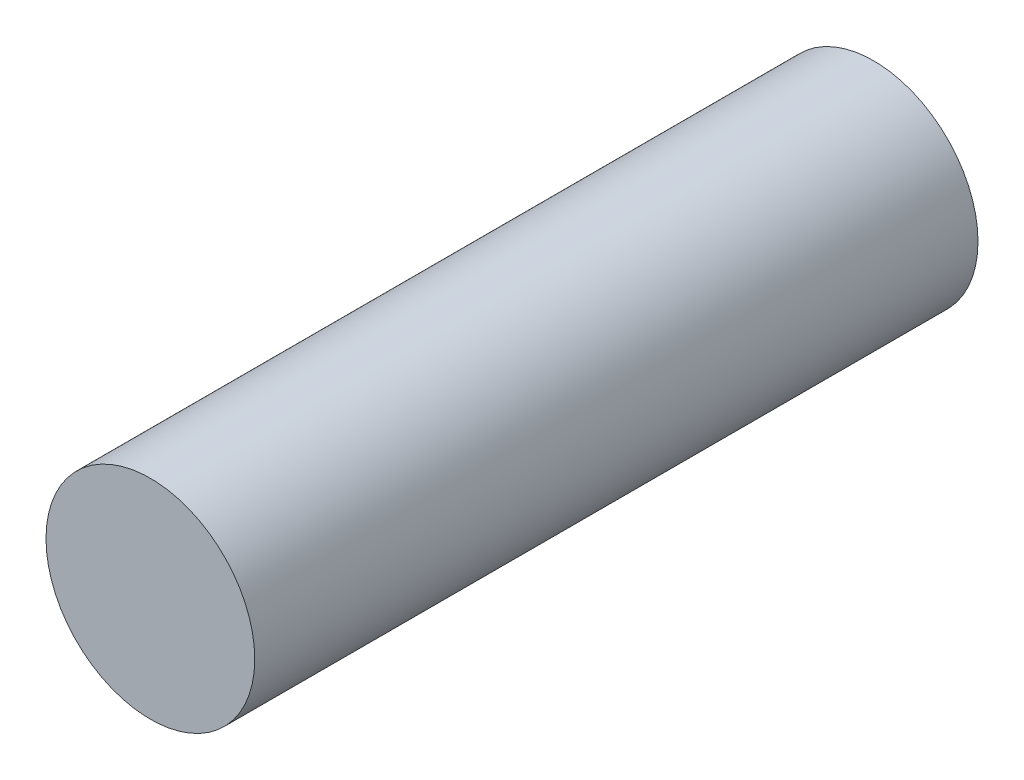
ISO-10303-21;
HEADER;
FILE_DESCRIPTION(('STEP AP214'),'2;1');
FILE_NAME('part.step','',(''),(''),'','','');
FILE_SCHEMA(('AUTOMOTIVE_DESIGN { 1 0 10303 214 1 1 1 1 }'));
ENDSEC;
DATA;
#1=APPLICATION_CONTEXT('core data for automotive mechanical design processes');
#2=APPLICATION_PROTOCOL_DEFINITION('international standard','automotive_design',2000,#1);
#3=PRODUCT_CONTEXT('',#1,'mechanical');
#4=PRODUCT('Part','Part','',(#3));
#5=PRODUCT_RELATED_PRODUCT_CATEGORY('part','',(#4));
#6=PRODUCT_DEFINITION_FORMATION('','',#4);
#7=PRODUCT_DEFINITION_CONTEXT('part definition',#1,'design');
#8=PRODUCT_DEFINITION('design','',#6,#7);
#9=PRODUCT_DEFINITION_SHAPE('','',#8);
#10=(LENGTH_UNIT() NAMED_UNIT(*) SI_UNIT(.MILLI.,.METRE.));
#11=(NAMED_UNIT(*) PLANE_ANGLE_UNIT() SI_UNIT($,.RADIAN.));
#12=(NAMED_UNIT(*) SI_UNIT($,.STERADIAN.) SOLID_ANGLE_UNIT());
#13=UNCERTAINTY_MEASURE_WITH_UNIT(LENGTH_MEASURE(1.E-05),#10,'distance_accuracy_value','');
#14=(GEOMETRIC_REPRESENTATION_CONTEXT(3) GLOBAL_UNCERTAINTY_ASSIGNED_CONTEXT((#13)) GLOBAL_UNIT_ASSIGNED_CONTEXT((#10,
#11,#12)) REPRESENTATION_CONTEXT('',''));
#15=CARTESIAN_POINT('',(0.,0.,0.));
#16=DIRECTION('',(0.,0.,1.));
#17=DIRECTION('',(1.,0.,0.));
#18=AXIS2_PLACEMENT_3D('',#15,#16,#17);
#19=CARTESIAN_POINT('',(0.,0.,22.));
#20=DIRECTION('',(0.,0.,-1.));
#21=DIRECTION('',(-1.,0.,0.));
#22=AXIS2_PLACEMENT_3D('',#19,#20,#21);
#23=CYLINDRICAL_SURFACE('',#22,3.175);
#24=CARTESIAN_POINT('',(0.,0.,22.));
#25=DIRECTION('',(0.,0.,1.));
#26=DIRECTION('',(1.,0.,0.));
#27=AXIS2_PLACEMENT_3D('',#24,#25,#26);
#28=CIRCLE('',#27,3.175);
#29=CARTESIAN_POINT('',(3.175,0.,22.));
#30=VERTEX_POINT('',#29);
#31=EDGE_CURVE('E10',#30,#30,#28,.T.);
#32=ORIENTED_EDGE('',*,*,#31,.F.);
#33=EDGE_LOOP('',(#32));
#34=FACE_BOUND('',#33,.T.);
#35=CARTESIAN_POINT('',(0.,0.,0.));
#36=DIRECTION('',(0.,0.,1.));
#37=DIRECTION('',(1.,0.,0.));
#38=AXIS2_PLACEMENT_3D('',#35,#36,#37);
#39=CIRCLE('',#38,3.175);
#40=CARTESIAN_POINT('',(3.175,0.,0.));
#41=VERTEX_POINT('',#40);
#42=EDGE_CURVE('E46',#41,#41,#39,.T.);
#43=ORIENTED_EDGE('',*,*,#42,.T.);
#44=EDGE_LOOP('',(#43));
#45=FACE_BOUND('',#44,.T.);
#46=ADVANCED_FACE('F43',(#34,#45),#23,.T.);
#47=CARTESIAN_POINT('',(0.,0.,22.));
#48=DIRECTION('',(0.,0.,1.));
#49=DIRECTION('',(1.,0.,0.));
#50=AXIS2_PLACEMENT_3D('',#47,#48,#49);
#51=PLANE('',#50);
#52=ORIENTED_EDGE('',*,*,#31,.T.);
#53=EDGE_LOOP('',(#52));
#54=FACE_BOUND('',#53,.T.);
#55=ADVANCED_FACE('F60',(#54),#51,.T.);
#56=CARTESIAN_POINT('',(0.,0.,0.));
#57=DIRECTION('',(0.,0.,1.));
#58=DIRECTION('',(1.,0.,0.));
#59=AXIS2_PLACEMENT_3D('',#56,#57,#58);
#60=PLANE('',#59);
#61=ORIENTED_EDGE('',*,*,#42,.F.);
#62=EDGE_LOOP('',(#61));
#63=FACE_BOUND('',#62,.T.);
#64=ADVANCED_FACE('F58',(#63),#60,.F.);
#65=CLOSED_SHELL('',(#46,#55,#64));
#66=MANIFOLD_SOLID_BREP('B2',#65);
#67=ADVANCED_BREP_SHAPE_REPRESENTATION('',(#18,#66),#14);
#68=SHAPE_DEFINITION_REPRESENTATION(#9,#67);
ENDSEC;
END-ISO-10303-21;
